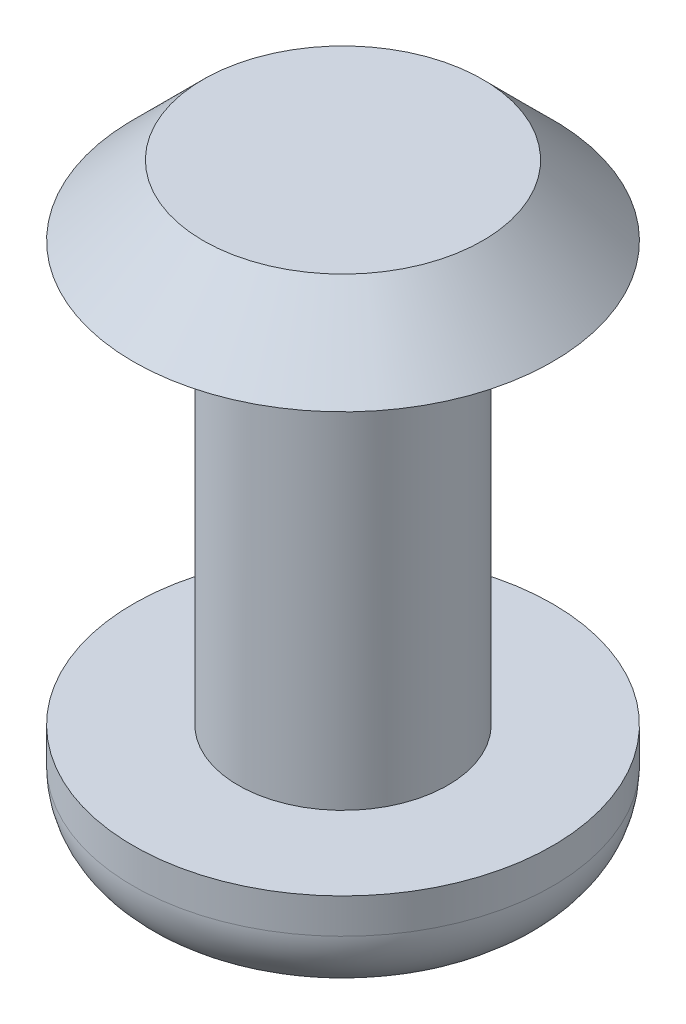
ISO-10303-21;
HEADER;
FILE_DESCRIPTION(('STEP AP214'),'2;1');
FILE_NAME('part.step','',(''),(''),'','','');
FILE_SCHEMA(('AUTOMOTIVE_DESIGN { 1 0 10303 214 1 1 1 1 }'));
ENDSEC;
DATA;
#1=APPLICATION_CONTEXT('core data for automotive mechanical design processes');
#2=APPLICATION_PROTOCOL_DEFINITION('international standard','automotive_design',2000,#1);
#3=PRODUCT_CONTEXT('',#1,'mechanical');
#4=PRODUCT('Part','Part','',(#3));
#5=PRODUCT_RELATED_PRODUCT_CATEGORY('part','',(#4));
#6=PRODUCT_DEFINITION_FORMATION('','',#4);
#7=PRODUCT_DEFINITION_CONTEXT('part definition',#1,'design');
#8=PRODUCT_DEFINITION('design','',#6,#7);
#9=PRODUCT_DEFINITION_SHAPE('','',#8);
#10=(LENGTH_UNIT() NAMED_UNIT(*) SI_UNIT(.MILLI.,.METRE.));
#11=(NAMED_UNIT(*) PLANE_ANGLE_UNIT() SI_UNIT($,.RADIAN.));
#12=(NAMED_UNIT(*) SI_UNIT($,.STERADIAN.) SOLID_ANGLE_UNIT());
#13=UNCERTAINTY_MEASURE_WITH_UNIT(LENGTH_MEASURE(1.E-05),#10,'distance_accuracy_value','');
#14=(GEOMETRIC_REPRESENTATION_CONTEXT(3) GLOBAL_UNCERTAINTY_ASSIGNED_CONTEXT((#13)) GLOBAL_UNIT_ASSIGNED_CONTEXT((#10,
#11,#12)) REPRESENTATION_CONTEXT('',''));
#15=CARTESIAN_POINT('',(0.,0.,0.));
#16=DIRECTION('',(0.,0.,1.));
#17=DIRECTION('',(1.,0.,0.));
#18=AXIS2_PLACEMENT_3D('',#15,#16,#17);
#19=CARTESIAN_POINT('',(0.,0.,0.));
#20=DIRECTION('',(0.,-1.,0.));
#21=DIRECTION('',(0.,0.,-1.));
#22=AXIS2_PLACEMENT_3D('',#19,#20,#21);
#23=CYLINDRICAL_SURFACE('',#22,1.5);
#24=CARTESIAN_POINT('',(0.,6.,0.));
#25=DIRECTION('',(0.,1.,0.));
#26=DIRECTION('',(0.,0.,1.));
#27=AXIS2_PLACEMENT_3D('',#24,#25,#26);
#28=CIRCLE('',#27,1.5);
#29=CARTESIAN_POINT('',(0.,6.,1.5));
#30=VERTEX_POINT('',#29);
#31=EDGE_CURVE('E52',#30,#30,#28,.F.);
#32=ORIENTED_EDGE('',*,*,#31,.T.);
#33=EDGE_LOOP('',(#32));
#34=FACE_BOUND('',#33,.T.);
#35=CARTESIAN_POINT('',(0.,0.,0.));
#36=DIRECTION('',(0.,-1.,0.));
#37=DIRECTION('',(0.,0.,-1.));
#38=AXIS2_PLACEMENT_3D('',#35,#36,#37);
#39=CIRCLE('',#38,1.5);
#40=CARTESIAN_POINT('',(0.,0.,-1.5));
#41=VERTEX_POINT('',#40);
#42=EDGE_CURVE('E47',#41,#41,#39,.T.);
#43=ORIENTED_EDGE('',*,*,#42,.F.);
#44=EDGE_LOOP('',(#43));
#45=FACE_BOUND('',#44,.T.);
#46=ADVANCED_FACE('F32',(#34,#45),#23,.T.);
#47=CARTESIAN_POINT('',(0.,7.,0.));
#48=DIRECTION('',(0.,1.,0.));
#49=DIRECTION('',(0.,0.,1.));
#50=AXIS2_PLACEMENT_3D('',#47,#48,#49);
#51=PLANE('',#50);
#52=CARTESIAN_POINT('',(0.,7.,0.));
#53=DIRECTION('',(0.,1.,0.));
#54=DIRECTION('',(0.,0.,1.));
#55=AXIS2_PLACEMENT_3D('',#52,#53,#54);
#56=CIRCLE('',#55,2.);
#57=CARTESIAN_POINT('',(0.,7.,2.));
#58=VERTEX_POINT('',#57);
#59=EDGE_CURVE('E43',#58,#58,#56,.T.);
#60=ORIENTED_EDGE('',*,*,#59,.T.);
#61=EDGE_LOOP('',(#60));
#62=FACE_BOUND('',#61,.T.);
#63=ADVANCED_FACE('F90',(#62),#51,.T.);
#64=CARTESIAN_POINT('',(0.,6.,0.));
#65=DIRECTION('',(0.,1.,0.));
#66=DIRECTION('',(0.,0.,1.));
#67=AXIS2_PLACEMENT_3D('',#64,#65,#66);
#68=PLANE('',#67);
#69=ORIENTED_EDGE('',*,*,#31,.F.);
#70=EDGE_LOOP('',(#69));
#71=FACE_BOUND('',#70,.T.);
#72=CARTESIAN_POINT('',(0.,6.,0.));
#73=DIRECTION('',(0.,1.,0.));
#74=DIRECTION('',(0.,0.,1.));
#75=AXIS2_PLACEMENT_3D('',#72,#73,#74);
#76=CIRCLE('',#75,3.);
#77=CARTESIAN_POINT('',(0.,6.,3.));
#78=VERTEX_POINT('',#77);
#79=EDGE_CURVE('E55',#78,#78,#76,.T.);
#80=ORIENTED_EDGE('',*,*,#79,.F.);
#81=EDGE_LOOP('',(#80));
#82=FACE_BOUND('',#81,.T.);
#83=ADVANCED_FACE('F96',(#71,#82),#68,.F.);
#84=CARTESIAN_POINT('',(0.,7.,0.));
#85=DIRECTION('',(0.,-1.,0.));
#86=DIRECTION('',(0.,0.,-1.));
#87=AXIS2_PLACEMENT_3D('',#84,#85,#86);
#88=CONICAL_SURFACE('',#87,2.,0.785398163397447);
#89=ORIENTED_EDGE('',*,*,#79,.T.);
#90=EDGE_LOOP('',(#89));
#91=FACE_BOUND('',#90,.T.);
#92=ORIENTED_EDGE('',*,*,#59,.F.);
#93=EDGE_LOOP('',(#92));
#94=FACE_BOUND('',#93,.T.);
#95=ADVANCED_FACE('F87',(#91,#94),#88,.T.);
#96=CARTESIAN_POINT('',(0.,-1.5,0.));
#97=DIRECTION('',(0.,1.,0.));
#98=DIRECTION('',(0.,0.,1.));
#99=AXIS2_PLACEMENT_3D('',#96,#97,#98);
#100=CYLINDRICAL_SURFACE('',#99,3.);
#101=CARTESIAN_POINT('',(0.,-0.5,0.));
#102=DIRECTION('',(0.,-1.,0.));
#103=DIRECTION('',(0.,0.,-1.));
#104=AXIS2_PLACEMENT_3D('',#101,#102,#103);
#105=CIRCLE('',#104,3.);
#106=CARTESIAN_POINT('',(0.,-0.5,-3.));
#107=VERTEX_POINT('',#106);
#108=EDGE_CURVE('E10',#107,#107,#105,.F.);
#109=ORIENTED_EDGE('',*,*,#108,.T.);
#110=EDGE_LOOP('',(#109));
#111=FACE_BOUND('',#110,.T.);
#112=CARTESIAN_POINT('',(0.,0.,0.));
#113=DIRECTION('',(0.,-1.,0.));
#114=DIRECTION('',(0.,0.,-1.));
#115=AXIS2_PLACEMENT_3D('',#112,#113,#114);
#116=CIRCLE('',#115,3.);
#117=CARTESIAN_POINT('',(0.,0.,-3.));
#118=VERTEX_POINT('',#117);
#119=EDGE_CURVE('E58',#118,#118,#116,.T.);
#120=ORIENTED_EDGE('',*,*,#119,.T.);
#121=EDGE_LOOP('',(#120));
#122=FACE_BOUND('',#121,.T.);
#123=ADVANCED_FACE('F79',(#111,#122),#100,.T.);
#124=CARTESIAN_POINT('',(0.,-1.5,0.));
#125=DIRECTION('',(0.,-1.,0.));
#126=DIRECTION('',(0.,0.,-1.));
#127=AXIS2_PLACEMENT_3D('',#124,#125,#126);
#128=PLANE('',#127);
#129=CARTESIAN_POINT('',(0.,-1.5,0.));
#130=DIRECTION('',(0.,-1.,0.));
#131=DIRECTION('',(0.,0.,-1.));
#132=AXIS2_PLACEMENT_3D('',#129,#130,#131);
#133=CIRCLE('',#132,1.25);
#134=CARTESIAN_POINT('',(0.,-1.5,-1.25));
#135=VERTEX_POINT('',#134);
#136=EDGE_CURVE('E62',#135,#135,#133,.T.);
#137=ORIENTED_EDGE('',*,*,#136,.F.);
#138=EDGE_LOOP('',(#137));
#139=FACE_BOUND('',#138,.T.);
#140=CARTESIAN_POINT('',(0.,-1.5,0.));
#141=DIRECTION('',(0.,-1.,0.));
#142=DIRECTION('',(0.,0.,-1.));
#143=AXIS2_PLACEMENT_3D('',#140,#141,#142);
#144=CIRCLE('',#143,2.);
#145=CARTESIAN_POINT('',(0.,-1.5,-2.));
#146=VERTEX_POINT('',#145);
#147=EDGE_CURVE('E39',#146,#146,#144,.T.);
#148=ORIENTED_EDGE('',*,*,#147,.T.);
#149=EDGE_LOOP('',(#148));
#150=FACE_BOUND('',#149,.T.);
#151=ADVANCED_FACE('F76',(#139,#150),#128,.T.);
#152=CARTESIAN_POINT('',(0.,0.,0.));
#153=DIRECTION('',(0.,-1.,0.));
#154=DIRECTION('',(0.,0.,-1.));
#155=AXIS2_PLACEMENT_3D('',#152,#153,#154);
#156=PLANE('',#155);
#157=ORIENTED_EDGE('',*,*,#42,.T.);
#158=EDGE_LOOP('',(#157));
#159=FACE_BOUND('',#158,.T.);
#160=ORIENTED_EDGE('',*,*,#119,.F.);
#161=EDGE_LOOP('',(#160));
#162=FACE_BOUND('',#161,.T.);
#163=ADVANCED_FACE('F78',(#159,#162),#156,.F.);
#164=CARTESIAN_POINT('',(0.,-0.5,0.));
#165=DIRECTION('',(0.,-1.,0.));
#166=DIRECTION('',(0.,0.,-1.));
#167=AXIS2_PLACEMENT_3D('',#164,#165,#166);
#168=TOROIDAL_SURFACE('',#167,2.,1.);
#169=ORIENTED_EDGE('',*,*,#108,.F.);
#170=EDGE_LOOP('',(#169));
#171=FACE_BOUND('',#170,.T.);
#172=ORIENTED_EDGE('',*,*,#147,.F.);
#173=EDGE_LOOP('',(#172));
#174=FACE_BOUND('',#173,.T.);
#175=ADVANCED_FACE('F34',(#171,#174),#168,.T.);
#176=CARTESIAN_POINT('',(0.,6.5,0.));
#177=DIRECTION('',(0.,-1.,0.));
#178=DIRECTION('',(0.,0.,-1.));
#179=AXIS2_PLACEMENT_3D('',#176,#177,#178);
#180=CYLINDRICAL_SURFACE('',#179,1.25);
#181=CARTESIAN_POINT('',(0.,6.5,0.));
#182=DIRECTION('',(0.,-1.,0.));
#183=DIRECTION('',(0.,0.,-1.));
#184=AXIS2_PLACEMENT_3D('',#181,#182,#183);
#185=CIRCLE('',#184,1.25);
#186=CARTESIAN_POINT('',(0.,6.5,-1.25));
#187=VERTEX_POINT('',#186);
#188=EDGE_CURVE('E61',#187,#187,#185,.T.);
#189=ORIENTED_EDGE('',*,*,#188,.F.);
#190=EDGE_LOOP('',(#189));
#191=FACE_BOUND('',#190,.T.);
#192=ORIENTED_EDGE('',*,*,#136,.T.);
#193=EDGE_LOOP('',(#192));
#194=FACE_BOUND('',#193,.T.);
#195=ADVANCED_FACE('F70',(#191,#194),#180,.F.);
#196=CARTESIAN_POINT('',(0.,6.5,0.));
#197=DIRECTION('',(0.,-1.,0.));
#198=DIRECTION('',(0.,0.,-1.));
#199=AXIS2_PLACEMENT_3D('',#196,#197,#198);
#200=PLANE('',#199);
#201=ORIENTED_EDGE('',*,*,#188,.T.);
#202=EDGE_LOOP('',(#201));
#203=FACE_BOUND('',#202,.T.);
#204=ADVANCED_FACE('F68',(#203),#200,.T.);
#205=CLOSED_SHELL('',(#46,#63,#83,#95,#123,#151,#163,#175,#195,#204));
#206=MANIFOLD_SOLID_BREP('B2',#205);
#207=ADVANCED_BREP_SHAPE_REPRESENTATION('',(#18,#206),#14);
#208=SHAPE_DEFINITION_REPRESENTATION(#9,#207);
ENDSEC;
END-ISO-10303-21;
